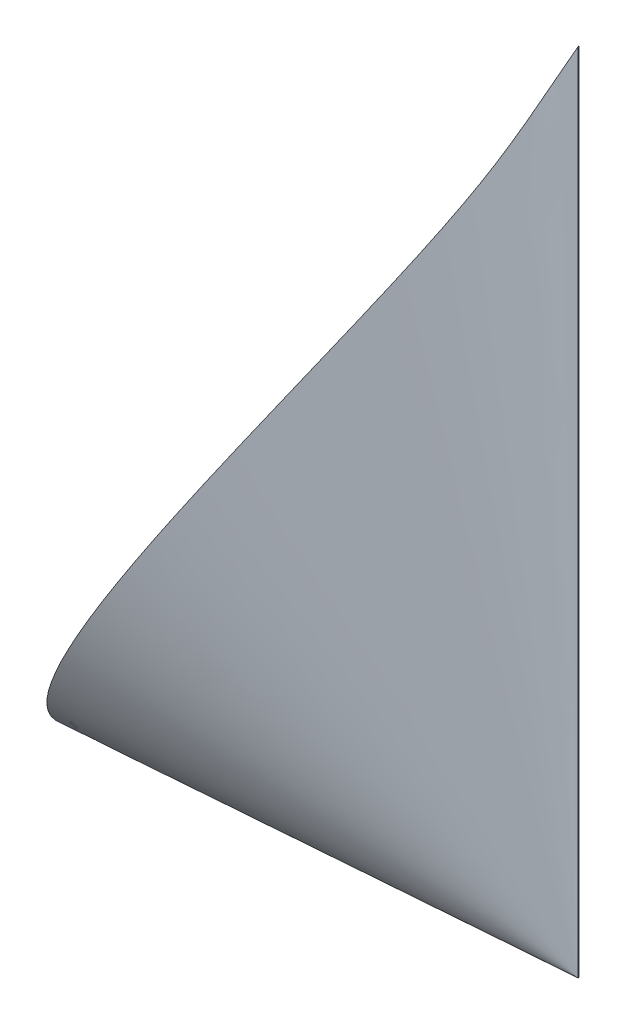
ISO-10303-21;
HEADER;
FILE_DESCRIPTION(('STEP AP214'),'2;1');
FILE_NAME('part.step','',(''),(''),'','','');
FILE_SCHEMA(('AUTOMOTIVE_DESIGN { 1 0 10303 214 1 1 1 1 }'));
ENDSEC;
DATA;
#1=APPLICATION_CONTEXT('core data for automotive mechanical design processes');
#2=APPLICATION_PROTOCOL_DEFINITION('international standard','automotive_design',2000,#1);
#3=PRODUCT_CONTEXT('',#1,'mechanical');
#4=PRODUCT('Part','Part','',(#3));
#5=PRODUCT_RELATED_PRODUCT_CATEGORY('part','',(#4));
#6=PRODUCT_DEFINITION_FORMATION('','',#4);
#7=PRODUCT_DEFINITION_CONTEXT('part definition',#1,'design');
#8=PRODUCT_DEFINITION('design','',#6,#7);
#9=PRODUCT_DEFINITION_SHAPE('','',#8);
#10=(LENGTH_UNIT() NAMED_UNIT(*) SI_UNIT(.MILLI.,.METRE.));
#11=(NAMED_UNIT(*) PLANE_ANGLE_UNIT() SI_UNIT($,.RADIAN.));
#12=(NAMED_UNIT(*) SI_UNIT($,.STERADIAN.) SOLID_ANGLE_UNIT());
#13=UNCERTAINTY_MEASURE_WITH_UNIT(LENGTH_MEASURE(1.E-05),#10,'distance_accuracy_value','');
#14=(GEOMETRIC_REPRESENTATION_CONTEXT(3) GLOBAL_UNCERTAINTY_ASSIGNED_CONTEXT((#13)) GLOBAL_UNIT_ASSIGNED_CONTEXT((#10,
#11,#12)) REPRESENTATION_CONTEXT('',''));
#15=CARTESIAN_POINT('',(0.,0.,0.));
#16=DIRECTION('',(0.,0.,1.));
#17=DIRECTION('',(1.,0.,0.));
#18=AXIS2_PLACEMENT_3D('',#15,#16,#17);
#19=CARTESIAN_POINT('',(0.,0.,0.));
#20=DIRECTION('',(0.,1.,0.));
#21=DIRECTION('',(0.,0.,1.));
#22=AXIS2_PLACEMENT_3D('',#19,#20,#21);
#23=PLANE('',#22);
#24=DIRECTION('',(0.,0.,-1.));
#25=VECTOR('',#24,1.);
#26=CARTESIAN_POINT('',(0.,0.,0.));
#27=LINE('',#26,#25);
#28=CARTESIAN_POINT('',(0.,0.,0.));
#29=VERTEX_POINT('',#28);
#30=CARTESIAN_POINT('',(0.,0.,-0.5));
#31=VERTEX_POINT('',#30);
#32=EDGE_CURVE('E114',#29,#31,#27,.T.);
#33=ORIENTED_EDGE('',*,*,#32,.F.);
#34=DIRECTION('',(1.,0.,0.));
#35=VECTOR('',#34,1.);
#36=CARTESIAN_POINT('',(0.,0.,0.));
#37=LINE('',#36,#35);
#38=CARTESIAN_POINT('',(-290.,0.,0.));
#39=VERTEX_POINT('',#38);
#40=EDGE_CURVE('E194',#39,#29,#37,.T.);
#41=ORIENTED_EDGE('',*,*,#40,.F.);
#42=DIRECTION('',(0.,0.,1.));
#43=VECTOR('',#42,1.);
#44=CARTESIAN_POINT('',(-290.,0.,0.));
#45=LINE('',#44,#43);
#46=CARTESIAN_POINT('',(-290.,0.,-0.499999999999965));
#47=VERTEX_POINT('',#46);
#48=EDGE_CURVE('E95',#47,#39,#45,.T.);
#49=ORIENTED_EDGE('',*,*,#48,.F.);
#50=DIRECTION('',(-1.,0.,0.));
#51=VECTOR('',#50,1.);
#52=CARTESIAN_POINT('',(0.,0.,-0.5));
#53=LINE('',#52,#51);
#54=EDGE_CURVE('E133',#31,#47,#53,.T.);
#55=ORIENTED_EDGE('',*,*,#54,.F.);
#56=EDGE_LOOP('',(#33,#41,#49,#55));
#57=FACE_BOUND('',#56,.T.);
#58=ADVANCED_FACE('F63',(#57),#23,.F.);
#59=CARTESIAN_POINT('',(0.,0.,0.));
#60=DIRECTION('',(-1.,0.,0.));
#61=DIRECTION('',(0.,0.,1.));
#62=AXIS2_PLACEMENT_3D('',#59,#60,#61);
#63=PLANE('',#62);
#64=DIRECTION('',(0.,-1.,0.));
#65=VECTOR('',#64,1.);
#66=CARTESIAN_POINT('',(0.,0.,0.));
#67=LINE('',#66,#65);
#68=CARTESIAN_POINT('',(0.,520.,0.));
#69=VERTEX_POINT('',#68);
#70=EDGE_CURVE('E127',#69,#29,#67,.T.);
#71=ORIENTED_EDGE('',*,*,#70,.T.);
#72=ORIENTED_EDGE('',*,*,#32,.T.);
#73=DIRECTION('',(0.,1.,0.));
#74=VECTOR('',#73,1.);
#75=CARTESIAN_POINT('',(0.,0.,-0.5));
#76=LINE('',#75,#74);
#77=CARTESIAN_POINT('',(0.,520.,-0.5));
#78=VERTEX_POINT('',#77);
#79=EDGE_CURVE('E86',#31,#78,#76,.T.);
#80=ORIENTED_EDGE('',*,*,#79,.T.);
#81=DIRECTION('',(0.,0.,1.));
#82=VECTOR('',#81,1.);
#83=CARTESIAN_POINT('',(0.,520.,0.));
#84=LINE('',#83,#82);
#85=EDGE_CURVE('E111',#78,#69,#84,.T.);
#86=ORIENTED_EDGE('',*,*,#85,.T.);
#87=EDGE_LOOP('',(#71,#72,#80,#86));
#88=FACE_BOUND('',#87,.T.);
#89=ADVANCED_FACE('F110',(#88),#63,.F.);
#90=CARTESIAN_POINT('',(0.,520.,-0.5));
#91=CARTESIAN_POINT('',(-5.10051518931791,510.854248626051,-0.18036094806901));
#92=CARTESIAN_POINT('',(-14.420767590226,494.142071907181,0.18685793132716));
#93=CARTESIAN_POINT('',(-26.7800972211141,471.980515327657,0.47287102856677));
#94=CARTESIAN_POINT('',(-38.4118130778558,451.123645515569,1.30622762192831));
#95=CARTESIAN_POINT('',(-50.0803691649159,430.200717359461,3.61151505030314));
#96=CARTESIAN_POINT('',(-62.4201416678889,408.074228733441,8.28194486943887));
#97=CARTESIAN_POINT('',(-75.9343285649742,383.841893607633,16.0350551874634));
#98=CARTESIAN_POINT('',(-90.9938492367973,356.838615161605,27.2684127834229));
#99=CARTESIAN_POINT('',(-107.836244081746,326.638458887903,41.9153159491063));
#100=CARTESIAN_POINT('',(-126.564574112923,293.056625728553,59.3004949199159));
#101=CARTESIAN_POINT('',(-147.146320616377,256.151425101669,77.9958203422489));
#102=CARTESIAN_POINT('',(-169.412284605063,216.22624829437,95.6759849525118));
#103=CARTESIAN_POINT('',(-193.055486953733,173.831540634686,108.974274550689));
#104=CARTESIAN_POINT('',(-217.63006626402,129.766777733481,113.3380413254));
#105=CARTESIAN_POINT('',(-242.550180074505,85.0824357284746,102.884615817677));
#106=CARTESIAN_POINT('',(-267.088909216326,41.0819558879678,70.2576313716912));
#107=CARTESIAN_POINT('',(-282.614403546464,13.2431384684102,27.740441227275));
#108=CARTESIAN_POINT('',(-290.,0.,-0.499999999999965));
#109=CARTESIAN_POINT('',(0.,476.666666666667,-0.5));
#110=CARTESIAN_POINT('',(-4.67547225687475,468.283061240546,-0.206997535729926));
#111=CARTESIAN_POINT('',(-13.2190369577072,452.963565914916,0.12961977038323));
#112=CARTESIAN_POINT('',(-24.5484224526879,432.648805717019,0.391798442852872));
#113=CARTESIAN_POINT('',(-35.2108286547012,413.530008389271,1.15570865343429));
#114=CARTESIAN_POINT('',(-45.9070050678396,394.350657579506,3.26888879611121));
#115=CARTESIAN_POINT('',(-57.2184631955649,374.068043005654,7.55011613031896));
#116=CARTESIAN_POINT('',(-69.6064678512263,351.85506914033,14.6571339218414));
#117=CARTESIAN_POINT('',(-83.4110284670643,327.102063898138,24.9543783848043));
#118=CARTESIAN_POINT('',(-98.8498904082674,299.418587313911,38.3807062866807));
#119=CARTESIAN_POINT('',(-116.017526270179,268.635240251173,54.3171203432563));
#120=CARTESIAN_POINT('',(-134.884127231679,234.805473009863,71.4545019803948));
#121=CARTESIAN_POINT('',(-155.294594221308,198.207394269839,87.6613195398025));
#122=CARTESIAN_POINT('',(-176.967529707589,159.345578915129,99.8514183381312));
#123=CARTESIAN_POINT('',(-199.494227408685,118.952879589024,103.851537881617));
#124=CARTESIAN_POINT('',(-222.337665068296,77.9922327511017,94.269231166204));
#125=CARTESIAN_POINT('',(-244.831500114965,37.6584595639705,64.361162090717));
#126=CARTESIAN_POINT('',(-259.063203250925,12.1395435960427,25.3870711250021));
#127=CARTESIAN_POINT('',(-265.833333333333,0.,-0.499999999999968));
#128=CARTESIAN_POINT('',(0.,390.,-0.5));
#129=CARTESIAN_POINT('',(-3.82538639198844,383.140686469538,-0.260270711051758));
#130=CARTESIAN_POINT('',(-10.8155756926695,370.606553930386,0.0151434484953703));
#131=CARTESIAN_POINT('',(-20.0850729158356,353.985386495743,0.229653271425078));
#132=CARTESIAN_POINT('',(-28.8088598083919,338.342734136677,0.854670716446235));
#133=CARTESIAN_POINT('',(-37.560276873687,322.650538019596,2.58363628772736));
#134=CARTESIAN_POINT('',(-46.8151062509167,306.05567155008,6.08645865207915));
#135=CARTESIAN_POINT('',(-56.9507464237307,287.881420205724,11.9012913905975));
#136=CARTESIAN_POINT('',(-68.2453869275981,267.628961371204,20.3263095875672));
#137=CARTESIAN_POINT('',(-80.8771830613098,244.978844165928,31.3114869618297));
#138=CARTESIAN_POINT('',(-94.923430584692,219.792469296414,44.350371189937));
#139=CARTESIAN_POINT('',(-110.359740462283,192.113568826251,58.3718652566866));
#140=CARTESIAN_POINT('',(-127.059213453797,162.169686220777,71.6319887143839));
#141=CARTESIAN_POINT('',(-144.7916152153,130.373655476014,81.6057059130164));
#142=CARTESIAN_POINT('',(-163.222549698015,97.3250833001105,84.8785309940502));
#143=CARTESIAN_POINT('',(-181.912635055879,63.8118267963559,77.0384618632578));
#144=CARTESIAN_POINT('',(-200.316681912244,30.8114669159759,52.5682235287684));
#145=CARTESIAN_POINT('',(-211.960802659848,9.93235385130765,20.6803309204562));
#146=CARTESIAN_POINT('',(-217.5,0.,-0.499999999999973));
#147=CARTESIAN_POINT('',(0.,260.,-0.500000000000001));
#148=CARTESIAN_POINT('',(-2.55025759465895,255.427124313025,-0.340180474034506));
#149=CARTESIAN_POINT('',(-7.210383795113,247.07103595359,-0.156571034336421));
#150=CARTESIAN_POINT('',(-13.390048610557,235.990257663829,-0.0135644857166156));
#151=CARTESIAN_POINT('',(-19.2059065389279,225.561822757784,0.403113810964156));
#152=CARTESIAN_POINT('',(-25.0401845824579,215.10035867973,1.55575752515157));
#153=CARTESIAN_POINT('',(-31.2100708339444,204.03711436672,3.89097243471943));
#154=CARTESIAN_POINT('',(-37.967164282487,191.920946803816,7.76752759373168));
#155=CARTESIAN_POINT('',(-45.4969246183986,178.419307580802,13.3842063917115));
#156=CARTESIAN_POINT('',(-53.918122040873,163.319229443952,20.7076579745531));
#157=CARTESIAN_POINT('',(-63.2822870564612,146.528312864276,29.400247459958));
#158=CARTESIAN_POINT('',(-73.5731603081885,128.075712550834,38.7479101711244));
#159=CARTESIAN_POINT('',(-84.7061423025315,108.113124147185,47.5879924762559));
#160=CARTESIAN_POINT('',(-96.5277434768664,86.9157703173429,54.2371372753443));
#161=CARTESIAN_POINT('',(-108.81503313201,64.8833888667403,56.4190206627001));
#162=CARTESIAN_POINT('',(-121.275090037252,42.5412178642373,51.1923079088385));
#163=CARTESIAN_POINT('',(-133.544454608163,20.5409779439839,34.8788156858456));
#164=CARTESIAN_POINT('',(-141.307201773232,6.62156923420509,13.6202206136375));
#165=CARTESIAN_POINT('',(-145.,0.,-0.499999999999983));
#166=CARTESIAN_POINT('',(0.,130.,-0.5));
#167=CARTESIAN_POINT('',(-1.27512879732948,127.713562156513,-0.420090237017253));
#168=CARTESIAN_POINT('',(-3.60519189755651,123.535517976795,-0.32828551716821));
#169=CARTESIAN_POINT('',(-6.69502430527854,117.995128831914,-0.256782242858307));
#170=CARTESIAN_POINT('',(-9.60295326946397,112.780911378892,-0.0484430945179216));
#171=CARTESIAN_POINT('',(-12.520092291229,107.550179339865,0.527878762575786));
#172=CARTESIAN_POINT('',(-15.6050354169723,102.01855718336,1.69548621735972));
#173=CARTESIAN_POINT('',(-18.9835821412436,95.9604734019082,3.63376379686584));
#174=CARTESIAN_POINT('',(-22.7484623091994,89.2096537904013,6.44210319585573));
#175=CARTESIAN_POINT('',(-26.9590610204366,81.6596147219759,10.1038289872766));
#176=CARTESIAN_POINT('',(-31.6411435282307,73.2641564321382,14.450123729979));
#177=CARTESIAN_POINT('',(-36.7865801540943,64.0378562754172,19.1239550855622));
#178=CARTESIAN_POINT('',(-42.3530711512659,54.0565620735925,23.543996238128));
#179=CARTESIAN_POINT('',(-48.2638717384333,43.4578851586715,26.8685686376722));
#180=CARTESIAN_POINT('',(-54.4075165660052,32.4416944333702,27.9595103313501));
#181=CARTESIAN_POINT('',(-60.6375450186262,21.2706089321187,25.3461539544193));
#182=CARTESIAN_POINT('',(-66.7722273040815,10.270488971992,17.1894078429228));
#183=CARTESIAN_POINT('',(-70.653600886616,3.31078461710255,6.56011030681875));
#184=CARTESIAN_POINT('',(-72.5000000000001,0.,-0.499999999999991));
#185=CARTESIAN_POINT('',(0.,43.3333333333333,-0.5));
#186=CARTESIAN_POINT('',(-0.42504293244316,42.5711873855042,-0.473363412339085));
#187=CARTESIAN_POINT('',(-1.20173063251884,41.1785059922651,-0.44276183905607));
#188=CARTESIAN_POINT('',(-2.23167476842618,39.3317096106381,-0.418927414286103));
#189=CARTESIAN_POINT('',(-3.20098442315465,37.5936371262974,-0.349481031505974));
#190=CARTESIAN_POINT('',(-4.17336409707633,35.8500597799551,-0.157373745808072));
#191=CARTESIAN_POINT('',(-5.20167847232408,34.0061857277867,0.231828739119906));
#192=CARTESIAN_POINT('',(-6.32786071374785,31.9868244673027,0.877921265621947));
#193=CARTESIAN_POINT('',(-7.58282076973311,29.7365512634671,1.81403439861858));
#194=CARTESIAN_POINT('',(-8.98635367347886,27.219871573992,3.03460966242552));
#195=CARTESIAN_POINT('',(-10.5470478427436,24.4213854773794,4.48337457665967));
#196=CARTESIAN_POINT('',(-12.2621933846981,21.3459520918057,6.04131836185408));
#197=CARTESIAN_POINT('',(-14.1176903837553,18.0188540245308,7.51466541270932));
#198=CARTESIAN_POINT('',(-16.0879572461444,14.4859617195572,8.62285621255739));
#199=CARTESIAN_POINT('',(-18.135838855335,10.8138981444567,8.98650344378336));
#200=CARTESIAN_POINT('',(-20.2125150062087,7.09020297737288,8.1153846514731));
#201=CARTESIAN_POINT('',(-22.2574091013605,3.42349632399732,5.39646928097427));
#202=CARTESIAN_POINT('',(-23.5512002955386,1.10359487236752,1.85337010227292));
#203=CARTESIAN_POINT('',(-24.1666666666667,0.,-0.499999999999998));
#204=CARTESIAN_POINT('',(0.,0.,-0.5));
#205=CARTESIAN_POINT('',(0.,0.,-0.5));
#206=CARTESIAN_POINT('',(0.,0.,-0.5));
#207=CARTESIAN_POINT('',(0.,0.,-0.5));
#208=CARTESIAN_POINT('',(0.,0.,-0.5));
#209=CARTESIAN_POINT('',(0.,0.,-0.5));
#210=CARTESIAN_POINT('',(0.,0.,-0.5));
#211=CARTESIAN_POINT('',(0.,0.,-0.5));
#212=CARTESIAN_POINT('',(0.,0.,-0.5));
#213=CARTESIAN_POINT('',(0.,0.,-0.5));
#214=CARTESIAN_POINT('',(0.,0.,-0.5));
#215=CARTESIAN_POINT('',(0.,0.,-0.5));
#216=CARTESIAN_POINT('',(0.,0.,-0.5));
#217=CARTESIAN_POINT('',(0.,0.,-0.5));
#218=CARTESIAN_POINT('',(0.,0.,-0.5));
#219=CARTESIAN_POINT('',(0.,0.,-0.5));
#220=CARTESIAN_POINT('',(0.,0.,-0.5));
#221=CARTESIAN_POINT('',(0.,0.,-0.5));
#222=CARTESIAN_POINT('',(0.,0.,-0.5));
#223=B_SPLINE_SURFACE_WITH_KNOTS('',3,3,((#90,#91,#92,#93,#94,#95,#96,#97,#98,#99,#100,#101,
#102,#103,#104,#105,#106,#107,#108),(#109,#110,#111,#112,#113,#114,#115,#116,#117,#118,#119,
#120,#121,#122,#123,#124,#125,#126,#127),(#128,#129,#130,#131,#132,#133,#134,#135,#136,#137,
#138,#139,#140,#141,#142,#143,#144,#145,#146),(#147,#148,#149,#150,#151,#152,#153,#154,#155,
#156,#157,#158,#159,#160,#161,#162,#163,#164,#165),(#166,#167,#168,#169,#170,#171,#172,#173,
#174,#175,#176,#177,#178,#179,#180,#181,#182,#183,#184),(#185,#186,#187,#188,#189,#190,#191,
#192,#193,#194,#195,#196,#197,#198,#199,#200,#201,#202,#203),(#204,#205,#206,#207,#208,#209,
#210,#211,#212,#213,#214,#215,#216,#217,#218,#219,#220,#221,#222)),.UNSPECIFIED.,.F.,.F.,.F.,(4,
1,1,1,4),(4,1,1,1,1,1,1,1,1,1,1,1,1,1,1,1,4),(0.00134089259466851,0.251005669446001,
0.500670446297334,0.750335223148667,1.),(0.,0.0625,0.125,0.1875,0.25,0.3125,0.375,0.4375,0.5,
0.5625,0.625,0.6875,0.75,0.8125,0.875,0.9375,1.),.UNSPECIFIED.);
#224=CARTESIAN_POINT('',(0.,520.,-0.5));
#225=CARTESIAN_POINT('',(-5.10051518931791,510.854248626051,-0.18036094806901));
#226=CARTESIAN_POINT('',(-14.420767590226,494.142071907181,0.18685793132716));
#227=CARTESIAN_POINT('',(-26.7800972211141,471.980515327657,0.47287102856677));
#228=CARTESIAN_POINT('',(-38.4118130778558,451.123645515569,1.30622762192831));
#229=CARTESIAN_POINT('',(-50.0803691649159,430.200717359461,3.61151505030314));
#230=CARTESIAN_POINT('',(-62.4201416678889,408.074228733441,8.28194486943887));
#231=CARTESIAN_POINT('',(-75.9343285649742,383.841893607633,16.0350551874634));
#232=CARTESIAN_POINT('',(-90.9938492367973,356.838615161605,27.2684127834229));
#233=CARTESIAN_POINT('',(-107.836244081746,326.638458887903,41.9153159491063));
#234=CARTESIAN_POINT('',(-126.564574112923,293.056625728553,59.3004949199159));
#235=CARTESIAN_POINT('',(-147.146320616377,256.151425101669,77.9958203422489));
#236=CARTESIAN_POINT('',(-169.412284605063,216.22624829437,95.6759849525118));
#237=CARTESIAN_POINT('',(-193.055486953733,173.831540634686,108.974274550689));
#238=CARTESIAN_POINT('',(-217.63006626402,129.766777733481,113.3380413254));
#239=CARTESIAN_POINT('',(-242.550180074505,85.0824357284746,102.884615817677));
#240=CARTESIAN_POINT('',(-267.088909216326,41.0819558879678,70.2576313716912));
#241=CARTESIAN_POINT('',(-282.614403546464,13.2431384684102,27.740441227275));
#242=CARTESIAN_POINT('',(-290.,0.,-0.499999999999965));
#243=B_SPLINE_CURVE_WITH_KNOTS('',3,(#224,#225,#226,#227,#228,#229,#230,#231,#232,#233,#234,
#235,#236,#237,#238,#239,#240,#241,#242),.UNSPECIFIED.,.F.,.F.,(4,1,1,1,1,1,1,1,1,1,1,1,1,1,1,1,
4),(0.,0.0625,0.125,0.1875,0.25,0.3125,0.375,0.4375,0.5,0.5625,0.625,0.6875,0.75,0.8125,0.875,
0.9375,1.),.UNSPECIFIED.);
#244=EDGE_CURVE('E13',#78,#47,#243,.T.);
#245=ORIENTED_EDGE('',*,*,#79,.F.);
#246=ORIENTED_EDGE('',*,*,#54,.T.);
#247=ORIENTED_EDGE('',*,*,#244,.F.);
#248=EDGE_LOOP('',(#245,#246,#247));
#249=FACE_BOUND('',#248,.T.);
#250=ADVANCED_FACE('F132',(#249),#223,.T.);
#251=CARTESIAN_POINT('',(0.,520.,0.));
#252=DIRECTION('',(-0.873363874328257,0.48706831452922,0.));
#253=DIRECTION('',(0.,0.,-1.));
#254=AXIS2_PLACEMENT_3D('',#251,#252,#253);
#255=PLANE('',#254);
#256=ORIENTED_EDGE('',*,*,#85,.F.);
#257=ORIENTED_EDGE('',*,*,#244,.T.);
#258=ORIENTED_EDGE('',*,*,#48,.T.);
#259=CARTESIAN_POINT('',(0.,520.,0.));
#260=CARTESIAN_POINT('',(-5.09925151181567,510.856514530537,0.32006822904911));
#261=CARTESIAN_POINT('',(-14.4157939432925,494.150990170648,0.687780170664764));
#262=CARTESIAN_POINT('',(-26.7673820489254,472.003314946754,0.974177295688453));
#263=CARTESIAN_POINT('',(-38.3903794184895,451.162078284088,1.80865283111588));
#264=CARTESIAN_POINT('',(-50.0502664834913,430.254694581326,4.11703555278786));
#265=CARTESIAN_POINT('',(-62.3822712019904,408.142134396431,8.79373632535701));
#266=CARTESIAN_POINT('',(-75.8902671925899,383.92090020639,16.5572566903475));
#267=CARTESIAN_POINT('',(-90.9456718667721,356.925002169926,27.8056972369375));
#268=CARTESIAN_POINT('',(-107.786344566755,326.727933880301,42.472266696999));
#269=CARTESIAN_POINT('',(-126.515484684942,293.144648151138,59.8807886259474));
#270=CARTESIAN_POINT('',(-147.100529844734,256.233532692201,78.6012161308907));
#271=CARTESIAN_POINT('',(-169.372053876788,216.298386151966,96.3051197744461));
#272=CARTESIAN_POINT('',(-193.022665477134,173.890392937553,109.621264893002));
#273=CARTESIAN_POINT('',(-217.605904592426,129.810102110133,113.990890866823));
#274=CARTESIAN_POINT('',(-242.53514215467,85.1094002743857,103.523429617826));
#275=CARTESIAN_POINT('',(-267.082482965724,41.0934788200801,70.8526371481559));
#276=CARTESIAN_POINT('',(-282.612599061344,13.2463740969007,28.2783594700778));
#277=CARTESIAN_POINT('',(-290.,0.,0.));
#278=B_SPLINE_CURVE_WITH_KNOTS('',3,(#259,#260,#261,#262,#263,#264,#265,#266,#267,#268,#269,
#270,#271,#272,#273,#274,#275,#276,#277),.UNSPECIFIED.,.F.,.F.,(4,1,1,1,1,1,1,1,1,1,1,1,1,1,1,1,
4),(0.,0.0625,0.125,0.1875,0.25,0.3125,0.375,0.4375,0.5,0.5625,0.625,0.6875,0.75,0.8125,0.875,
0.9375,1.),.UNSPECIFIED.);
#279=EDGE_CURVE('E78',#69,#39,#278,.T.);
#280=ORIENTED_EDGE('',*,*,#279,.F.);
#281=EDGE_LOOP('',(#256,#257,#258,#280));
#282=FACE_BOUND('',#281,.T.);
#283=ADVANCED_FACE('F122',(#282),#255,.T.);
#284=CARTESIAN_POINT('',(0.,0.,0.));
#285=CARTESIAN_POINT('',(0.,0.,0.));
#286=CARTESIAN_POINT('',(0.,0.,0.));
#287=CARTESIAN_POINT('',(0.,0.,0.));
#288=CARTESIAN_POINT('',(0.,0.,0.));
#289=CARTESIAN_POINT('',(0.,0.,0.));
#290=CARTESIAN_POINT('',(0.,0.,0.));
#291=CARTESIAN_POINT('',(0.,0.,0.));
#292=CARTESIAN_POINT('',(0.,0.,0.));
#293=CARTESIAN_POINT('',(0.,0.,0.));
#294=CARTESIAN_POINT('',(0.,0.,0.));
#295=CARTESIAN_POINT('',(0.,0.,0.));
#296=CARTESIAN_POINT('',(0.,0.,0.));
#297=CARTESIAN_POINT('',(0.,0.,0.));
#298=CARTESIAN_POINT('',(0.,0.,0.));
#299=CARTESIAN_POINT('',(0.,0.,0.));
#300=CARTESIAN_POINT('',(0.,0.,0.));
#301=CARTESIAN_POINT('',(0.,0.,0.));
#302=CARTESIAN_POINT('',(0.,0.,0.));
#303=CARTESIAN_POINT('',(0.,173.333333333333,0.));
#304=CARTESIAN_POINT('',(-1.69975050393856,170.285504843512,0.106689409683037));
#305=CARTESIAN_POINT('',(-4.80526464776416,164.716996723549,0.229260056888255));
#306=CARTESIAN_POINT('',(-8.92246068297515,157.334438315585,0.324725765229484));
#307=CARTESIAN_POINT('',(-12.7967931394965,150.387359428029,0.602884277038627));
#308=CARTESIAN_POINT('',(-16.6834221611638,143.418231527109,1.37234518426262));
#309=CARTESIAN_POINT('',(-20.7940904006635,136.047378132144,2.93124544178567));
#310=CARTESIAN_POINT('',(-25.2967557308633,127.97363340213,5.51908556344916));
#311=CARTESIAN_POINT('',(-30.3152239555907,118.975000723309,9.26856574564584));
#312=CARTESIAN_POINT('',(-35.9287815222518,108.909311293434,14.157422232333));
#313=CARTESIAN_POINT('',(-42.1718282283141,97.714882717046,19.9602628753158));
#314=CARTESIAN_POINT('',(-49.0335099482447,85.411177564067,26.2004053769636));
#315=CARTESIAN_POINT('',(-56.4573512922628,72.0994620506553,32.101706591482));
#316=CARTESIAN_POINT('',(-64.340888492378,57.9634643125176,36.5404216310006));
#317=CARTESIAN_POINT('',(-72.5353015308086,43.270034036711,37.9969636222744));
#318=CARTESIAN_POINT('',(-80.8450473848899,28.3698000914619,34.5078098726088));
#319=CARTESIAN_POINT('',(-89.0274943219082,13.69782627336,23.617545716052));
#320=CARTESIAN_POINT('',(-94.2041996871147,4.41545803230023,9.42611982335926));
#321=CARTESIAN_POINT('',(-96.6666666666667,0.,0.));
#322=CARTESIAN_POINT('',(0.,346.666666666667,0.));
#323=CARTESIAN_POINT('',(-3.39950100787711,340.571009687025,0.213378819366073));
#324=CARTESIAN_POINT('',(-9.61052929552833,329.433993447099,0.45852011377651));
#325=CARTESIAN_POINT('',(-17.8449213659503,314.66887663117,0.649451530458969));
#326=CARTESIAN_POINT('',(-25.593586278993,300.774718856058,1.20576855407725));
#327=CARTESIAN_POINT('',(-33.3668443223276,286.836463054217,2.74469036852524));
#328=CARTESIAN_POINT('',(-41.588180801327,272.094756264287,5.86249088357134));
#329=CARTESIAN_POINT('',(-50.5935114617266,255.94726680426,11.0381711268983));
#330=CARTESIAN_POINT('',(-60.6304479111814,237.950001446617,18.5371314912917));
#331=CARTESIAN_POINT('',(-71.8575630445035,217.818622586867,28.314844464666));
#332=CARTESIAN_POINT('',(-84.3436564566282,195.429765434092,39.9205257506316));
#333=CARTESIAN_POINT('',(-98.0670198964894,170.822355128134,52.4008107539271));
#334=CARTESIAN_POINT('',(-112.914702584526,144.198924101311,64.203413182964));
#335=CARTESIAN_POINT('',(-128.681776984756,115.926928625035,73.0808432620012));
#336=CARTESIAN_POINT('',(-145.070603061617,86.5400680734221,75.9939272445488));
#337=CARTESIAN_POINT('',(-161.69009476978,56.7396001829238,69.0156197452175));
#338=CARTESIAN_POINT('',(-178.054988643816,27.3956525467201,47.2350914321039));
#339=CARTESIAN_POINT('',(-188.408399374229,8.83091606460046,18.8522396467185));
#340=CARTESIAN_POINT('',(-193.333333333333,0.,0.));
#341=CARTESIAN_POINT('',(0.,520.,0.));
#342=CARTESIAN_POINT('',(-5.09925151181567,510.856514530537,0.32006822904911));
#343=CARTESIAN_POINT('',(-14.4157939432925,494.150990170648,0.687780170664764));
#344=CARTESIAN_POINT('',(-26.7673820489254,472.003314946754,0.974177295688453));
#345=CARTESIAN_POINT('',(-38.3903794184895,451.162078284088,1.80865283111588));
#346=CARTESIAN_POINT('',(-50.0502664834913,430.254694581326,4.11703555278786));
#347=CARTESIAN_POINT('',(-62.3822712019904,408.142134396431,8.79373632535701));
#348=CARTESIAN_POINT('',(-75.8902671925899,383.92090020639,16.5572566903475));
#349=CARTESIAN_POINT('',(-90.9456718667721,356.925002169926,27.8056972369375));
#350=CARTESIAN_POINT('',(-107.786344566755,326.727933880301,42.472266696999));
#351=CARTESIAN_POINT('',(-126.515484684942,293.144648151138,59.8807886259474));
#352=CARTESIAN_POINT('',(-147.100529844734,256.233532692201,78.6012161308907));
#353=CARTESIAN_POINT('',(-169.372053876788,216.298386151966,96.3051197744461));
#354=CARTESIAN_POINT('',(-193.022665477134,173.890392937553,109.621264893002));
#355=CARTESIAN_POINT('',(-217.605904592426,129.810102110133,113.990890866823));
#356=CARTESIAN_POINT('',(-242.53514215467,85.1094002743857,103.523429617826));
#357=CARTESIAN_POINT('',(-267.082482965724,41.0934788200801,70.8526371481559));
#358=CARTESIAN_POINT('',(-282.612599061344,13.2463740969007,28.2783594700778));
#359=CARTESIAN_POINT('',(-290.,0.,0.));
#360=B_SPLINE_SURFACE_WITH_KNOTS('',3,3,((#284,#285,#286,#287,#288,#289,#290,#291,#292,#293,
#294,#295,#296,#297,#298,#299,#300,#301,#302),(#303,#304,#305,#306,#307,#308,#309,#310,#311,
#312,#313,#314,#315,#316,#317,#318,#319,#320,#321),(#322,#323,#324,#325,#326,#327,#328,#329,
#330,#331,#332,#333,#334,#335,#336,#337,#338,#339,#340),(#341,#342,#343,#344,#345,#346,#347,
#348,#349,#350,#351,#352,#353,#354,#355,#356,#357,#358,#359)),.UNSPECIFIED.,.F.,.F.,.F.,(4,4),
(4,1,1,1,1,1,1,1,1,1,1,1,1,1,1,1,4),(0.,1.),(0.,0.0625,0.125,0.1875,0.25,0.3125,0.375,0.4375,
0.5,0.5625,0.625,0.6875,0.75,0.8125,0.875,0.9375,1.),.UNSPECIFIED.);
#361=ORIENTED_EDGE('',*,*,#70,.F.);
#362=ORIENTED_EDGE('',*,*,#279,.T.);
#363=ORIENTED_EDGE('',*,*,#40,.T.);
#364=EDGE_LOOP('',(#361,#362,#363));
#365=FACE_BOUND('',#364,.T.);
#366=ADVANCED_FACE('F65',(#365),#360,.T.);
#367=CLOSED_SHELL('',(#58,#89,#250,#283,#366));
#368=MANIFOLD_SOLID_BREP('B2',#367);
#369=ADVANCED_BREP_SHAPE_REPRESENTATION('',(#18,#368),#14);
#370=SHAPE_DEFINITION_REPRESENTATION(#9,#369);
ENDSEC;
END-ISO-10303-21;
